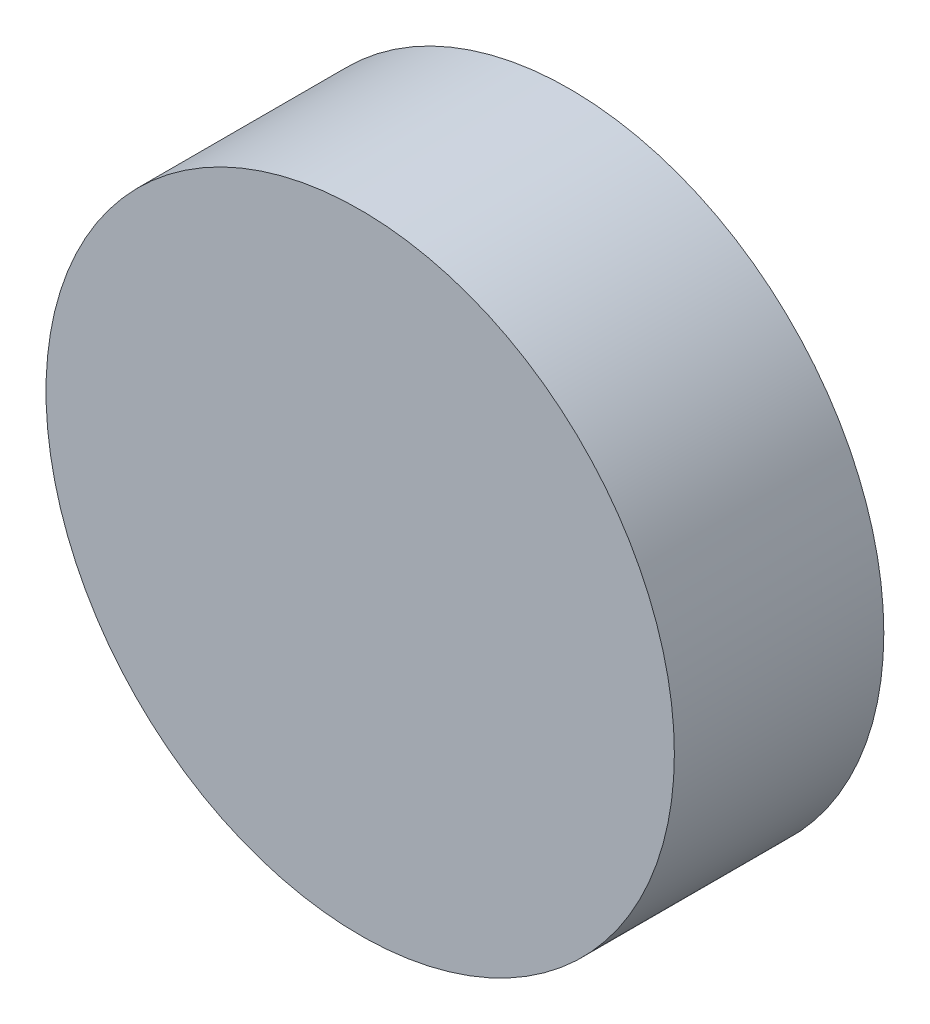
ISO-10303-21;
HEADER;
FILE_DESCRIPTION(('STEP AP214'),'2;1');
FILE_NAME('part.step','',(''),(''),'','','');
FILE_SCHEMA(('AUTOMOTIVE_DESIGN { 1 0 10303 214 1 1 1 1 }'));
ENDSEC;
DATA;
#1=APPLICATION_CONTEXT('core data for automotive mechanical design processes');
#2=APPLICATION_PROTOCOL_DEFINITION('international standard','automotive_design',2000,#1);
#3=PRODUCT_CONTEXT('',#1,'mechanical');
#4=PRODUCT('Part','Part','',(#3));
#5=PRODUCT_RELATED_PRODUCT_CATEGORY('part','',(#4));
#6=PRODUCT_DEFINITION_FORMATION('','',#4);
#7=PRODUCT_DEFINITION_CONTEXT('part definition',#1,'design');
#8=PRODUCT_DEFINITION('design','',#6,#7);
#9=PRODUCT_DEFINITION_SHAPE('','',#8);
#10=(LENGTH_UNIT() NAMED_UNIT(*) SI_UNIT(.MILLI.,.METRE.));
#11=(NAMED_UNIT(*) PLANE_ANGLE_UNIT() SI_UNIT($,.RADIAN.));
#12=(NAMED_UNIT(*) SI_UNIT($,.STERADIAN.) SOLID_ANGLE_UNIT());
#13=UNCERTAINTY_MEASURE_WITH_UNIT(LENGTH_MEASURE(1.E-05),#10,'distance_accuracy_value','');
#14=(GEOMETRIC_REPRESENTATION_CONTEXT(3) GLOBAL_UNCERTAINTY_ASSIGNED_CONTEXT((#13)) GLOBAL_UNIT_ASSIGNED_CONTEXT((#10,
#11,#12)) REPRESENTATION_CONTEXT('',''));
#15=CARTESIAN_POINT('',(0.,0.,0.));
#16=DIRECTION('',(0.,0.,1.));
#17=DIRECTION('',(1.,0.,0.));
#18=AXIS2_PLACEMENT_3D('',#15,#16,#17);
#19=CARTESIAN_POINT('',(0.,0.,2.5));
#20=DIRECTION('',(0.,0.,-1.));
#21=DIRECTION('',(-1.,0.,0.));
#22=AXIS2_PLACEMENT_3D('',#19,#20,#21);
#23=CYLINDRICAL_SURFACE('',#22,3.75);
#24=CARTESIAN_POINT('',(0.,0.,2.5));
#25=DIRECTION('',(0.,0.,1.));
#26=DIRECTION('',(1.,0.,0.));
#27=AXIS2_PLACEMENT_3D('',#24,#25,#26);
#28=CIRCLE('',#27,3.75);
#29=CARTESIAN_POINT('',(3.75,0.,2.5));
#30=VERTEX_POINT('',#29);
#31=EDGE_CURVE('E10',#30,#30,#28,.T.);
#32=ORIENTED_EDGE('',*,*,#31,.F.);
#33=EDGE_LOOP('',(#32));
#34=FACE_BOUND('',#33,.T.);
#35=CARTESIAN_POINT('',(0.,0.,0.));
#36=DIRECTION('',(0.,0.,1.));
#37=DIRECTION('',(1.,0.,0.));
#38=AXIS2_PLACEMENT_3D('',#35,#36,#37);
#39=CIRCLE('',#38,3.75);
#40=CARTESIAN_POINT('',(3.75,0.,0.));
#41=VERTEX_POINT('',#40);
#42=EDGE_CURVE('E34',#41,#41,#39,.T.);
#43=ORIENTED_EDGE('',*,*,#42,.T.);
#44=EDGE_LOOP('',(#43));
#45=FACE_BOUND('',#44,.T.);
#46=ADVANCED_FACE('F31',(#34,#45),#23,.T.);
#47=CARTESIAN_POINT('',(0.,0.,2.5));
#48=DIRECTION('',(0.,0.,1.));
#49=DIRECTION('',(1.,0.,0.));
#50=AXIS2_PLACEMENT_3D('',#47,#48,#49);
#51=PLANE('',#50);
#52=ORIENTED_EDGE('',*,*,#31,.T.);
#53=EDGE_LOOP('',(#52));
#54=FACE_BOUND('',#53,.T.);
#55=ADVANCED_FACE('F46',(#54),#51,.T.);
#56=CARTESIAN_POINT('',(0.,0.,0.));
#57=DIRECTION('',(0.,0.,1.));
#58=DIRECTION('',(1.,0.,0.));
#59=AXIS2_PLACEMENT_3D('',#56,#57,#58);
#60=PLANE('',#59);
#61=ORIENTED_EDGE('',*,*,#42,.F.);
#62=EDGE_LOOP('',(#61));
#63=FACE_BOUND('',#62,.T.);
#64=ADVANCED_FACE('F44',(#63),#60,.F.);
#65=CLOSED_SHELL('',(#46,#55,#64));
#66=MANIFOLD_SOLID_BREP('B2',#65);
#67=ADVANCED_BREP_SHAPE_REPRESENTATION('',(#18,#66),#14);
#68=SHAPE_DEFINITION_REPRESENTATION(#9,#67);
ENDSEC;
END-ISO-10303-21;
